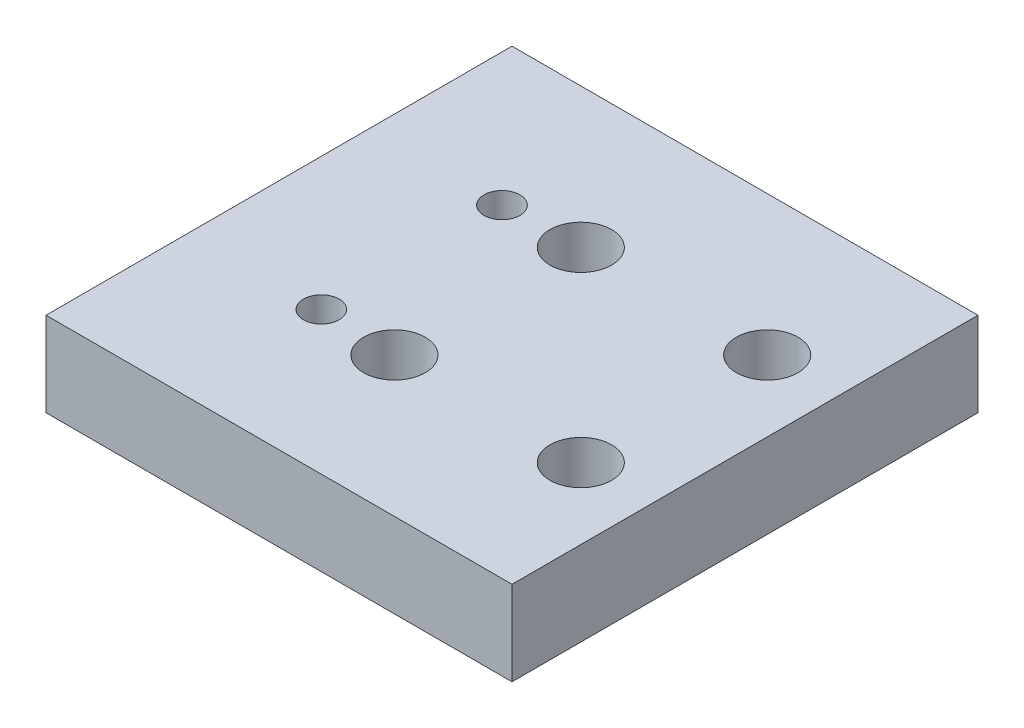
ISO-10303-21;
HEADER;
FILE_DESCRIPTION(('STEP AP214'),'2;1');
FILE_NAME('part.step','',(''),(''),'','','');
FILE_SCHEMA(('AUTOMOTIVE_DESIGN { 1 0 10303 214 1 1 1 1 }'));
ENDSEC;
DATA;
#1=APPLICATION_CONTEXT('core data for automotive mechanical design processes');
#2=APPLICATION_PROTOCOL_DEFINITION('international standard','automotive_design',2000,#1);
#3=PRODUCT_CONTEXT('',#1,'mechanical');
#4=PRODUCT('Part','Part','',(#3));
#5=PRODUCT_RELATED_PRODUCT_CATEGORY('part','',(#4));
#6=PRODUCT_DEFINITION_FORMATION('','',#4);
#7=PRODUCT_DEFINITION_CONTEXT('part definition',#1,'design');
#8=PRODUCT_DEFINITION('design','',#6,#7);
#9=PRODUCT_DEFINITION_SHAPE('','',#8);
#10=(LENGTH_UNIT() NAMED_UNIT(*) SI_UNIT(.MILLI.,.METRE.));
#11=(NAMED_UNIT(*) PLANE_ANGLE_UNIT() SI_UNIT($,.RADIAN.));
#12=(NAMED_UNIT(*) SI_UNIT($,.STERADIAN.) SOLID_ANGLE_UNIT());
#13=UNCERTAINTY_MEASURE_WITH_UNIT(LENGTH_MEASURE(1.E-05),#10,'distance_accuracy_value','');
#14=(GEOMETRIC_REPRESENTATION_CONTEXT(3) GLOBAL_UNCERTAINTY_ASSIGNED_CONTEXT((#13)) GLOBAL_UNIT_ASSIGNED_CONTEXT((#10,
#11,#12)) REPRESENTATION_CONTEXT('',''));
#15=CARTESIAN_POINT('',(0.,0.,0.));
#16=DIRECTION('',(0.,0.,1.));
#17=DIRECTION('',(1.,0.,0.));
#18=AXIS2_PLACEMENT_3D('',#15,#16,#17);
#19=CARTESIAN_POINT('',(-32.5,11.7824246,-32.5));
#20=DIRECTION('',(1.,0.,0.));
#21=DIRECTION('',(0.,0.,-1.));
#22=AXIS2_PLACEMENT_3D('',#19,#20,#21);
#23=PLANE('',#22);
#24=DIRECTION('',(0.,0.,1.));
#25=VECTOR('',#24,1.);
#26=CARTESIAN_POINT('',(-32.5,0.,-32.5));
#27=LINE('',#26,#25);
#28=CARTESIAN_POINT('',(-32.5,0.,-32.5));
#29=VERTEX_POINT('',#28);
#30=CARTESIAN_POINT('',(-32.5,0.,32.5));
#31=VERTEX_POINT('',#30);
#32=EDGE_CURVE('E96',#29,#31,#27,.T.);
#33=ORIENTED_EDGE('',*,*,#32,.T.);
#34=DIRECTION('',(0.,-1.,0.));
#35=VECTOR('',#34,1.);
#36=CARTESIAN_POINT('',(-32.5,11.7824246,32.5));
#37=LINE('',#36,#35);
#38=CARTESIAN_POINT('',(-32.5,11.7824246,32.5));
#39=VERTEX_POINT('',#38);
#40=EDGE_CURVE('E11',#39,#31,#37,.T.);
#41=ORIENTED_EDGE('',*,*,#40,.F.);
#42=DIRECTION('',(0.,0.,1.));
#43=VECTOR('',#42,1.);
#44=CARTESIAN_POINT('',(-32.5,11.7824246,-32.5));
#45=LINE('',#44,#43);
#46=CARTESIAN_POINT('',(-32.5,11.7824246,-32.5));
#47=VERTEX_POINT('',#46);
#48=EDGE_CURVE('E84',#47,#39,#45,.T.);
#49=ORIENTED_EDGE('',*,*,#48,.F.);
#50=DIRECTION('',(0.,-1.,0.));
#51=VECTOR('',#50,1.);
#52=CARTESIAN_POINT('',(-32.5,11.7824246,-32.5));
#53=LINE('',#52,#51);
#54=EDGE_CURVE('E92',#47,#29,#53,.T.);
#55=ORIENTED_EDGE('',*,*,#54,.T.);
#56=EDGE_LOOP('',(#33,#41,#49,#55));
#57=FACE_BOUND('',#56,.T.);
#58=ADVANCED_FACE('F33',(#57),#23,.F.);
#59=CARTESIAN_POINT('',(-32.5,11.7824246,32.5));
#60=DIRECTION('',(0.,0.,-1.));
#61=DIRECTION('',(-1.,0.,0.));
#62=AXIS2_PLACEMENT_3D('',#59,#60,#61);
#63=PLANE('',#62);
#64=DIRECTION('',(1.,0.,0.));
#65=VECTOR('',#64,1.);
#66=CARTESIAN_POINT('',(-32.5,0.,32.5));
#67=LINE('',#66,#65);
#68=CARTESIAN_POINT('',(32.5,0.,32.5));
#69=VERTEX_POINT('',#68);
#70=EDGE_CURVE('E88',#31,#69,#67,.T.);
#71=ORIENTED_EDGE('',*,*,#70,.T.);
#72=DIRECTION('',(0.,-1.,0.));
#73=VECTOR('',#72,1.);
#74=CARTESIAN_POINT('',(32.5,11.7824246,32.5));
#75=LINE('',#74,#73);
#76=CARTESIAN_POINT('',(32.5,11.7824246,32.5));
#77=VERTEX_POINT('',#76);
#78=EDGE_CURVE('E41',#77,#69,#75,.T.);
#79=ORIENTED_EDGE('',*,*,#78,.F.);
#80=DIRECTION('',(1.,0.,0.));
#81=VECTOR('',#80,1.);
#82=CARTESIAN_POINT('',(-32.5,11.7824246,32.5));
#83=LINE('',#82,#81);
#84=EDGE_CURVE('E79',#39,#77,#83,.T.);
#85=ORIENTED_EDGE('',*,*,#84,.F.);
#86=ORIENTED_EDGE('',*,*,#40,.T.);
#87=EDGE_LOOP('',(#71,#79,#85,#86));
#88=FACE_BOUND('',#87,.T.);
#89=ADVANCED_FACE('F87',(#88),#63,.F.);
#90=CARTESIAN_POINT('',(32.5,11.7824246,-32.5));
#91=DIRECTION('',(-1.,0.,0.));
#92=DIRECTION('',(0.,0.,1.));
#93=AXIS2_PLACEMENT_3D('',#90,#91,#92);
#94=PLANE('',#93);
#95=DIRECTION('',(0.,0.,-1.));
#96=VECTOR('',#95,1.);
#97=CARTESIAN_POINT('',(32.5,0.,-32.5));
#98=LINE('',#97,#96);
#99=CARTESIAN_POINT('',(32.5,0.,-32.5));
#100=VERTEX_POINT('',#99);
#101=EDGE_CURVE('E66',#69,#100,#98,.T.);
#102=ORIENTED_EDGE('',*,*,#101,.T.);
#103=DIRECTION('',(0.,-1.,0.));
#104=VECTOR('',#103,1.);
#105=CARTESIAN_POINT('',(32.5,11.7824246,-32.5));
#106=LINE('',#105,#104);
#107=CARTESIAN_POINT('',(32.5,11.7824246,-32.5));
#108=VERTEX_POINT('',#107);
#109=EDGE_CURVE('E89',#108,#100,#106,.T.);
#110=ORIENTED_EDGE('',*,*,#109,.F.);
#111=DIRECTION('',(0.,0.,-1.));
#112=VECTOR('',#111,1.);
#113=CARTESIAN_POINT('',(32.5,11.7824246,-32.5));
#114=LINE('',#113,#112);
#115=EDGE_CURVE('E82',#77,#108,#114,.T.);
#116=ORIENTED_EDGE('',*,*,#115,.F.);
#117=ORIENTED_EDGE('',*,*,#78,.T.);
#118=EDGE_LOOP('',(#102,#110,#116,#117));
#119=FACE_BOUND('',#118,.T.);
#120=ADVANCED_FACE('F90',(#119),#94,.F.);
#121=CARTESIAN_POINT('',(-32.5,11.7824246,-32.5));
#122=DIRECTION('',(0.,0.,1.));
#123=DIRECTION('',(1.,0.,0.));
#124=AXIS2_PLACEMENT_3D('',#121,#122,#123);
#125=PLANE('',#124);
#126=DIRECTION('',(-1.,0.,0.));
#127=VECTOR('',#126,1.);
#128=CARTESIAN_POINT('',(-32.5,0.,-32.5));
#129=LINE('',#128,#127);
#130=EDGE_CURVE('E72',#100,#29,#129,.T.);
#131=ORIENTED_EDGE('',*,*,#130,.T.);
#132=ORIENTED_EDGE('',*,*,#54,.F.);
#133=DIRECTION('',(-1.,0.,0.));
#134=VECTOR('',#133,1.);
#135=CARTESIAN_POINT('',(-32.5,11.7824246,-32.5));
#136=LINE('',#135,#134);
#137=EDGE_CURVE('E49',#108,#47,#136,.T.);
#138=ORIENTED_EDGE('',*,*,#137,.F.);
#139=ORIENTED_EDGE('',*,*,#109,.T.);
#140=EDGE_LOOP('',(#131,#132,#138,#139));
#141=FACE_BOUND('',#140,.T.);
#142=ADVANCED_FACE('F104',(#141),#125,.F.);
#143=CARTESIAN_POINT('',(-32.5,11.7824246,32.5));
#144=DIRECTION('',(0.,1.,0.));
#145=DIRECTION('',(0.,0.,1.));
#146=AXIS2_PLACEMENT_3D('',#143,#144,#145);
#147=PLANE('',#146);
#148=CARTESIAN_POINT('',(-3.40263883752311,11.7824246,13.));
#149=DIRECTION('',(0.,1.,0.));
#150=DIRECTION('',(0.,0.,1.));
#151=AXIS2_PLACEMENT_3D('',#148,#149,#150);
#152=CIRCLE('',#151,4.3);
#153=CARTESIAN_POINT('',(-3.40263883752311,11.7824246,17.3));
#154=VERTEX_POINT('',#153);
#155=EDGE_CURVE('E166',#154,#154,#152,.T.);
#156=ORIENTED_EDGE('',*,*,#155,.F.);
#157=EDGE_LOOP('',(#156));
#158=FACE_BOUND('',#157,.T.);
#159=CARTESIAN_POINT('',(22.5973611624769,11.7824246,13.));
#160=DIRECTION('',(0.,1.,0.));
#161=DIRECTION('',(0.,0.,1.));
#162=AXIS2_PLACEMENT_3D('',#159,#160,#161);
#163=CIRCLE('',#162,4.3);
#164=CARTESIAN_POINT('',(22.5973611624769,11.7824246,17.3));
#165=VERTEX_POINT('',#164);
#166=EDGE_CURVE('E154',#165,#165,#163,.T.);
#167=ORIENTED_EDGE('',*,*,#166,.F.);
#168=EDGE_LOOP('',(#167));
#169=FACE_BOUND('',#168,.T.);
#170=CARTESIAN_POINT('',(22.5973611624769,11.7824246,-13.));
#171=DIRECTION('',(0.,1.,0.));
#172=DIRECTION('',(0.,0.,1.));
#173=AXIS2_PLACEMENT_3D('',#170,#171,#172);
#174=CIRCLE('',#173,4.3);
#175=CARTESIAN_POINT('',(22.5973611624769,11.7824246,-8.70000000000001));
#176=VERTEX_POINT('',#175);
#177=EDGE_CURVE('E142',#176,#176,#174,.T.);
#178=ORIENTED_EDGE('',*,*,#177,.F.);
#179=EDGE_LOOP('',(#178));
#180=FACE_BOUND('',#179,.T.);
#181=CARTESIAN_POINT('',(-3.40263883752311,11.7824246,-13.));
#182=DIRECTION('',(0.,1.,0.));
#183=DIRECTION('',(0.,0.,1.));
#184=AXIS2_PLACEMENT_3D('',#181,#182,#183);
#185=CIRCLE('',#184,4.3);
#186=CARTESIAN_POINT('',(-3.40263883752311,11.7824246,-8.70000000000001));
#187=VERTEX_POINT('',#186);
#188=EDGE_CURVE('E130',#187,#187,#185,.T.);
#189=ORIENTED_EDGE('',*,*,#188,.F.);
#190=EDGE_LOOP('',(#189));
#191=FACE_BOUND('',#190,.T.);
#192=CARTESIAN_POINT('',(-14.0000000000001,11.7824246,-12.6));
#193=DIRECTION('',(0.,1.,0.));
#194=DIRECTION('',(0.,0.,1.));
#195=AXIS2_PLACEMENT_3D('',#192,#193,#194);
#196=CIRCLE('',#195,2.5);
#197=CARTESIAN_POINT('',(-14.0000000000001,11.7824246,-10.1));
#198=VERTEX_POINT('',#197);
#199=EDGE_CURVE('E118',#198,#198,#196,.T.);
#200=ORIENTED_EDGE('',*,*,#199,.F.);
#201=EDGE_LOOP('',(#200));
#202=FACE_BOUND('',#201,.T.);
#203=CARTESIAN_POINT('',(-14.0000000000001,11.7824246,12.6));
#204=DIRECTION('',(0.,1.,0.));
#205=DIRECTION('',(0.,0.,1.));
#206=AXIS2_PLACEMENT_3D('',#203,#204,#205);
#207=CIRCLE('',#206,2.5);
#208=CARTESIAN_POINT('',(-14.0000000000001,11.7824246,15.1));
#209=VERTEX_POINT('',#208);
#210=EDGE_CURVE('E112',#209,#209,#207,.T.);
#211=ORIENTED_EDGE('',*,*,#210,.F.);
#212=EDGE_LOOP('',(#211));
#213=FACE_BOUND('',#212,.T.);
#214=ORIENTED_EDGE('',*,*,#48,.T.);
#215=ORIENTED_EDGE('',*,*,#84,.T.);
#216=ORIENTED_EDGE('',*,*,#115,.T.);
#217=ORIENTED_EDGE('',*,*,#137,.T.);
#218=EDGE_LOOP('',(#214,#215,#216,#217));
#219=FACE_BOUND('',#218,.T.);
#220=ADVANCED_FACE('F80',(#158,#169,#180,#191,#202,#213,#219),#147,.T.);
#221=CARTESIAN_POINT('',(-32.5,0.,32.5));
#222=DIRECTION('',(0.,1.,0.));
#223=DIRECTION('',(0.,0.,1.));
#224=AXIS2_PLACEMENT_3D('',#221,#222,#223);
#225=PLANE('',#224);
#226=CARTESIAN_POINT('',(-3.40263883752311,0.,13.));
#227=DIRECTION('',(0.,1.,0.));
#228=DIRECTION('',(0.,0.,1.));
#229=AXIS2_PLACEMENT_3D('',#226,#227,#228);
#230=CIRCLE('',#229,2.4);
#231=CARTESIAN_POINT('',(-3.40263883752311,0.,15.4));
#232=VERTEX_POINT('',#231);
#233=EDGE_CURVE('E157',#232,#232,#230,.T.);
#234=ORIENTED_EDGE('',*,*,#233,.T.);
#235=EDGE_LOOP('',(#234));
#236=FACE_BOUND('',#235,.T.);
#237=CARTESIAN_POINT('',(22.5973611624769,0.,13.));
#238=DIRECTION('',(0.,1.,0.));
#239=DIRECTION('',(0.,0.,1.));
#240=AXIS2_PLACEMENT_3D('',#237,#238,#239);
#241=CIRCLE('',#240,2.4);
#242=CARTESIAN_POINT('',(22.5973611624769,0.,15.4));
#243=VERTEX_POINT('',#242);
#244=EDGE_CURVE('E145',#243,#243,#241,.T.);
#245=ORIENTED_EDGE('',*,*,#244,.T.);
#246=EDGE_LOOP('',(#245));
#247=FACE_BOUND('',#246,.T.);
#248=CARTESIAN_POINT('',(22.5973611624769,0.,-13.));
#249=DIRECTION('',(0.,1.,0.));
#250=DIRECTION('',(0.,0.,1.));
#251=AXIS2_PLACEMENT_3D('',#248,#249,#250);
#252=CIRCLE('',#251,2.4);
#253=CARTESIAN_POINT('',(22.5973611624769,0.,-10.6));
#254=VERTEX_POINT('',#253);
#255=EDGE_CURVE('E133',#254,#254,#252,.T.);
#256=ORIENTED_EDGE('',*,*,#255,.T.);
#257=EDGE_LOOP('',(#256));
#258=FACE_BOUND('',#257,.T.);
#259=CARTESIAN_POINT('',(-3.40263883752311,0.,-13.));
#260=DIRECTION('',(0.,1.,0.));
#261=DIRECTION('',(0.,0.,1.));
#262=AXIS2_PLACEMENT_3D('',#259,#260,#261);
#263=CIRCLE('',#262,2.4);
#264=CARTESIAN_POINT('',(-3.40263883752311,0.,-10.6));
#265=VERTEX_POINT('',#264);
#266=EDGE_CURVE('E121',#265,#265,#263,.T.);
#267=ORIENTED_EDGE('',*,*,#266,.T.);
#268=EDGE_LOOP('',(#267));
#269=FACE_BOUND('',#268,.T.);
#270=CARTESIAN_POINT('',(-14.0000000000001,0.,-12.6));
#271=DIRECTION('',(0.,1.,0.));
#272=DIRECTION('',(0.,0.,1.));
#273=AXIS2_PLACEMENT_3D('',#270,#271,#272);
#274=CIRCLE('',#273,2.5);
#275=CARTESIAN_POINT('',(-14.0000000000001,0.,-10.1));
#276=VERTEX_POINT('',#275);
#277=EDGE_CURVE('E115',#276,#276,#274,.T.);
#278=ORIENTED_EDGE('',*,*,#277,.T.);
#279=EDGE_LOOP('',(#278));
#280=FACE_BOUND('',#279,.T.);
#281=CARTESIAN_POINT('',(-14.0000000000001,0.,12.6));
#282=DIRECTION('',(0.,1.,0.));
#283=DIRECTION('',(0.,0.,1.));
#284=AXIS2_PLACEMENT_3D('',#281,#282,#283);
#285=CIRCLE('',#284,2.5);
#286=CARTESIAN_POINT('',(-14.0000000000001,0.,15.1));
#287=VERTEX_POINT('',#286);
#288=EDGE_CURVE('E99',#287,#287,#285,.T.);
#289=ORIENTED_EDGE('',*,*,#288,.T.);
#290=EDGE_LOOP('',(#289));
#291=FACE_BOUND('',#290,.T.);
#292=ORIENTED_EDGE('',*,*,#32,.F.);
#293=ORIENTED_EDGE('',*,*,#130,.F.);
#294=ORIENTED_EDGE('',*,*,#101,.F.);
#295=ORIENTED_EDGE('',*,*,#70,.F.);
#296=EDGE_LOOP('',(#292,#293,#294,#295));
#297=FACE_BOUND('',#296,.T.);
#298=ADVANCED_FACE('F107',(#236,#247,#258,#269,#280,#291,#297),#225,.F.);
#299=CARTESIAN_POINT('',(-14.0000000000001,11.7824246,12.6));
#300=DIRECTION('',(0.,1.,0.));
#301=DIRECTION('',(0.,0.,1.));
#302=AXIS2_PLACEMENT_3D('',#299,#300,#301);
#303=CYLINDRICAL_SURFACE('',#302,2.5);
#304=ORIENTED_EDGE('',*,*,#288,.F.);
#305=EDGE_LOOP('',(#304));
#306=FACE_BOUND('',#305,.T.);
#307=ORIENTED_EDGE('',*,*,#210,.T.);
#308=EDGE_LOOP('',(#307));
#309=FACE_BOUND('',#308,.T.);
#310=ADVANCED_FACE('F185',(#306,#309),#303,.F.);
#311=CARTESIAN_POINT('',(-14.0000000000001,11.7824246,-12.6));
#312=DIRECTION('',(0.,1.,0.));
#313=DIRECTION('',(0.,0.,1.));
#314=AXIS2_PLACEMENT_3D('',#311,#312,#313);
#315=CYLINDRICAL_SURFACE('',#314,2.5);
#316=ORIENTED_EDGE('',*,*,#277,.F.);
#317=EDGE_LOOP('',(#316));
#318=FACE_BOUND('',#317,.T.);
#319=ORIENTED_EDGE('',*,*,#199,.T.);
#320=EDGE_LOOP('',(#319));
#321=FACE_BOUND('',#320,.T.);
#322=ADVANCED_FACE('F187',(#318,#321),#315,.F.);
#323=CARTESIAN_POINT('',(-3.40263883752311,11.7824246,-13.));
#324=DIRECTION('',(0.,1.,0.));
#325=DIRECTION('',(0.,0.,1.));
#326=AXIS2_PLACEMENT_3D('',#323,#324,#325);
#327=CYLINDRICAL_SURFACE('',#326,2.4);
#328=ORIENTED_EDGE('',*,*,#266,.F.);
#329=EDGE_LOOP('',(#328));
#330=FACE_BOUND('',#329,.T.);
#331=CARTESIAN_POINT('',(-3.40263883752311,3.5824246,-13.));
#332=DIRECTION('',(0.,1.,0.));
#333=DIRECTION('',(0.,0.,1.));
#334=AXIS2_PLACEMENT_3D('',#331,#332,#333);
#335=CIRCLE('',#334,2.4);
#336=CARTESIAN_POINT('',(-3.40263883752311,3.5824246,-10.6));
#337=VERTEX_POINT('',#336);
#338=EDGE_CURVE('E124',#337,#337,#335,.T.);
#339=ORIENTED_EDGE('',*,*,#338,.T.);
#340=EDGE_LOOP('',(#339));
#341=FACE_BOUND('',#340,.T.);
#342=ADVANCED_FACE('F194',(#330,#341),#327,.F.);
#343=CARTESIAN_POINT('',(-1.00263883752311,3.5824246,-13.));
#344=DIRECTION('',(0.,-1.,0.));
#345=DIRECTION('',(0.,0.,-1.));
#346=AXIS2_PLACEMENT_3D('',#343,#344,#345);
#347=PLANE('',#346);
#348=ORIENTED_EDGE('',*,*,#338,.F.);
#349=EDGE_LOOP('',(#348));
#350=FACE_BOUND('',#349,.T.);
#351=CARTESIAN_POINT('',(-3.40263883752311,3.5824246,-13.));
#352=DIRECTION('',(0.,1.,0.));
#353=DIRECTION('',(0.,0.,1.));
#354=AXIS2_PLACEMENT_3D('',#351,#352,#353);
#355=CIRCLE('',#354,4.3);
#356=CARTESIAN_POINT('',(-3.40263883752311,3.5824246,-8.70000000000001));
#357=VERTEX_POINT('',#356);
#358=EDGE_CURVE('E127',#357,#357,#355,.T.);
#359=ORIENTED_EDGE('',*,*,#358,.T.);
#360=EDGE_LOOP('',(#359));
#361=FACE_BOUND('',#360,.T.);
#362=ADVANCED_FACE('F233',(#350,#361),#347,.F.);
#363=CARTESIAN_POINT('',(-3.40263883752311,11.7824246,-13.));
#364=DIRECTION('',(0.,1.,0.));
#365=DIRECTION('',(0.,0.,1.));
#366=AXIS2_PLACEMENT_3D('',#363,#364,#365);
#367=CYLINDRICAL_SURFACE('',#366,4.3);
#368=ORIENTED_EDGE('',*,*,#358,.F.);
#369=EDGE_LOOP('',(#368));
#370=FACE_BOUND('',#369,.T.);
#371=ORIENTED_EDGE('',*,*,#188,.T.);
#372=EDGE_LOOP('',(#371));
#373=FACE_BOUND('',#372,.T.);
#374=ADVANCED_FACE('F244',(#370,#373),#367,.F.);
#375=CARTESIAN_POINT('',(22.5973611624769,11.7824246,-13.));
#376=DIRECTION('',(0.,1.,0.));
#377=DIRECTION('',(0.,0.,1.));
#378=AXIS2_PLACEMENT_3D('',#375,#376,#377);
#379=CYLINDRICAL_SURFACE('',#378,2.4);
#380=ORIENTED_EDGE('',*,*,#255,.F.);
#381=EDGE_LOOP('',(#380));
#382=FACE_BOUND('',#381,.T.);
#383=CARTESIAN_POINT('',(22.5973611624769,3.5824246,-13.));
#384=DIRECTION('',(0.,1.,0.));
#385=DIRECTION('',(0.,0.,1.));
#386=AXIS2_PLACEMENT_3D('',#383,#384,#385);
#387=CIRCLE('',#386,2.4);
#388=CARTESIAN_POINT('',(22.5973611624769,3.5824246,-10.6));
#389=VERTEX_POINT('',#388);
#390=EDGE_CURVE('E136',#389,#389,#387,.T.);
#391=ORIENTED_EDGE('',*,*,#390,.T.);
#392=EDGE_LOOP('',(#391));
#393=FACE_BOUND('',#392,.T.);
#394=ADVANCED_FACE('F254',(#382,#393),#379,.F.);
#395=CARTESIAN_POINT('',(24.9973611624769,3.5824246,-13.));
#396=DIRECTION('',(0.,-1.,0.));
#397=DIRECTION('',(0.,0.,-1.));
#398=AXIS2_PLACEMENT_3D('',#395,#396,#397);
#399=PLANE('',#398);
#400=ORIENTED_EDGE('',*,*,#390,.F.);
#401=EDGE_LOOP('',(#400));
#402=FACE_BOUND('',#401,.T.);
#403=CARTESIAN_POINT('',(22.5973611624769,3.5824246,-13.));
#404=DIRECTION('',(0.,1.,0.));
#405=DIRECTION('',(0.,0.,1.));
#406=AXIS2_PLACEMENT_3D('',#403,#404,#405);
#407=CIRCLE('',#406,4.3);
#408=CARTESIAN_POINT('',(22.5973611624769,3.5824246,-8.70000000000001));
#409=VERTEX_POINT('',#408);
#410=EDGE_CURVE('E139',#409,#409,#407,.T.);
#411=ORIENTED_EDGE('',*,*,#410,.T.);
#412=EDGE_LOOP('',(#411));
#413=FACE_BOUND('',#412,.T.);
#414=ADVANCED_FACE('F264',(#402,#413),#399,.F.);
#415=CARTESIAN_POINT('',(22.5973611624769,11.7824246,-13.));
#416=DIRECTION('',(0.,1.,0.));
#417=DIRECTION('',(0.,0.,1.));
#418=AXIS2_PLACEMENT_3D('',#415,#416,#417);
#419=CYLINDRICAL_SURFACE('',#418,4.3);
#420=ORIENTED_EDGE('',*,*,#410,.F.);
#421=EDGE_LOOP('',(#420));
#422=FACE_BOUND('',#421,.T.);
#423=ORIENTED_EDGE('',*,*,#177,.T.);
#424=EDGE_LOOP('',(#423));
#425=FACE_BOUND('',#424,.T.);
#426=ADVANCED_FACE('F274',(#422,#425),#419,.F.);
#427=CARTESIAN_POINT('',(22.5973611624769,11.7824246,13.));
#428=DIRECTION('',(0.,1.,0.));
#429=DIRECTION('',(0.,0.,1.));
#430=AXIS2_PLACEMENT_3D('',#427,#428,#429);
#431=CYLINDRICAL_SURFACE('',#430,2.4);
#432=ORIENTED_EDGE('',*,*,#244,.F.);
#433=EDGE_LOOP('',(#432));
#434=FACE_BOUND('',#433,.T.);
#435=CARTESIAN_POINT('',(22.5973611624769,3.5824246,13.));
#436=DIRECTION('',(0.,1.,0.));
#437=DIRECTION('',(0.,0.,1.));
#438=AXIS2_PLACEMENT_3D('',#435,#436,#437);
#439=CIRCLE('',#438,2.4);
#440=CARTESIAN_POINT('',(22.5973611624769,3.5824246,15.4));
#441=VERTEX_POINT('',#440);
#442=EDGE_CURVE('E148',#441,#441,#439,.T.);
#443=ORIENTED_EDGE('',*,*,#442,.T.);
#444=EDGE_LOOP('',(#443));
#445=FACE_BOUND('',#444,.T.);
#446=ADVANCED_FACE('F284',(#434,#445),#431,.F.);
#447=CARTESIAN_POINT('',(24.9973611624769,3.5824246,13.));
#448=DIRECTION('',(0.,-1.,0.));
#449=DIRECTION('',(0.,0.,-1.));
#450=AXIS2_PLACEMENT_3D('',#447,#448,#449);
#451=PLANE('',#450);
#452=ORIENTED_EDGE('',*,*,#442,.F.);
#453=EDGE_LOOP('',(#452));
#454=FACE_BOUND('',#453,.T.);
#455=CARTESIAN_POINT('',(22.5973611624769,3.5824246,13.));
#456=DIRECTION('',(0.,1.,0.));
#457=DIRECTION('',(0.,0.,1.));
#458=AXIS2_PLACEMENT_3D('',#455,#456,#457);
#459=CIRCLE('',#458,4.3);
#460=CARTESIAN_POINT('',(22.5973611624769,3.5824246,17.3));
#461=VERTEX_POINT('',#460);
#462=EDGE_CURVE('E151',#461,#461,#459,.T.);
#463=ORIENTED_EDGE('',*,*,#462,.T.);
#464=EDGE_LOOP('',(#463));
#465=FACE_BOUND('',#464,.T.);
#466=ADVANCED_FACE('F294',(#454,#465),#451,.F.);
#467=CARTESIAN_POINT('',(22.5973611624769,11.7824246,13.));
#468=DIRECTION('',(0.,1.,0.));
#469=DIRECTION('',(0.,0.,1.));
#470=AXIS2_PLACEMENT_3D('',#467,#468,#469);
#471=CYLINDRICAL_SURFACE('',#470,4.3);
#472=ORIENTED_EDGE('',*,*,#462,.F.);
#473=EDGE_LOOP('',(#472));
#474=FACE_BOUND('',#473,.T.);
#475=ORIENTED_EDGE('',*,*,#166,.T.);
#476=EDGE_LOOP('',(#475));
#477=FACE_BOUND('',#476,.T.);
#478=ADVANCED_FACE('F304',(#474,#477),#471,.F.);
#479=CARTESIAN_POINT('',(-3.40263883752311,11.7824246,13.));
#480=DIRECTION('',(0.,1.,0.));
#481=DIRECTION('',(0.,0.,1.));
#482=AXIS2_PLACEMENT_3D('',#479,#480,#481);
#483=CYLINDRICAL_SURFACE('',#482,2.4);
#484=ORIENTED_EDGE('',*,*,#233,.F.);
#485=EDGE_LOOP('',(#484));
#486=FACE_BOUND('',#485,.T.);
#487=CARTESIAN_POINT('',(-3.40263883752311,3.5824246,13.));
#488=DIRECTION('',(0.,1.,0.));
#489=DIRECTION('',(0.,0.,1.));
#490=AXIS2_PLACEMENT_3D('',#487,#488,#489);
#491=CIRCLE('',#490,2.4);
#492=CARTESIAN_POINT('',(-3.40263883752311,3.5824246,15.4));
#493=VERTEX_POINT('',#492);
#494=EDGE_CURVE('E160',#493,#493,#491,.T.);
#495=ORIENTED_EDGE('',*,*,#494,.T.);
#496=EDGE_LOOP('',(#495));
#497=FACE_BOUND('',#496,.T.);
#498=ADVANCED_FACE('F314',(#486,#497),#483,.F.);
#499=CARTESIAN_POINT('',(-1.00263883752311,3.5824246,13.));
#500=DIRECTION('',(0.,-1.,0.));
#501=DIRECTION('',(0.,0.,-1.));
#502=AXIS2_PLACEMENT_3D('',#499,#500,#501);
#503=PLANE('',#502);
#504=ORIENTED_EDGE('',*,*,#494,.F.);
#505=EDGE_LOOP('',(#504));
#506=FACE_BOUND('',#505,.T.);
#507=CARTESIAN_POINT('',(-3.40263883752311,3.5824246,13.));
#508=DIRECTION('',(0.,1.,0.));
#509=DIRECTION('',(0.,0.,1.));
#510=AXIS2_PLACEMENT_3D('',#507,#508,#509);
#511=CIRCLE('',#510,4.3);
#512=CARTESIAN_POINT('',(-3.40263883752311,3.5824246,17.3));
#513=VERTEX_POINT('',#512);
#514=EDGE_CURVE('E163',#513,#513,#511,.T.);
#515=ORIENTED_EDGE('',*,*,#514,.T.);
#516=EDGE_LOOP('',(#515));
#517=FACE_BOUND('',#516,.T.);
#518=ADVANCED_FACE('F324',(#506,#517),#503,.F.);
#519=CARTESIAN_POINT('',(-3.40263883752311,11.7824246,13.));
#520=DIRECTION('',(0.,1.,0.));
#521=DIRECTION('',(0.,0.,1.));
#522=AXIS2_PLACEMENT_3D('',#519,#520,#521);
#523=CYLINDRICAL_SURFACE('',#522,4.3);
#524=ORIENTED_EDGE('',*,*,#514,.F.);
#525=EDGE_LOOP('',(#524));
#526=FACE_BOUND('',#525,.T.);
#527=ORIENTED_EDGE('',*,*,#155,.T.);
#528=EDGE_LOOP('',(#527));
#529=FACE_BOUND('',#528,.T.);
#530=ADVANCED_FACE('F170',(#526,#529),#523,.F.);
#531=CLOSED_SHELL('',(#58,#89,#120,#142,#220,#298,#310,#322,#342,#362,#374,#394,#414,#426,#446,
#466,#478,#498,#518,#530));
#532=MANIFOLD_SOLID_BREP('B2',#531);
#533=ADVANCED_BREP_SHAPE_REPRESENTATION('',(#18,#532),#14);
#534=SHAPE_DEFINITION_REPRESENTATION(#9,#533);
ENDSEC;
END-ISO-10303-21;
